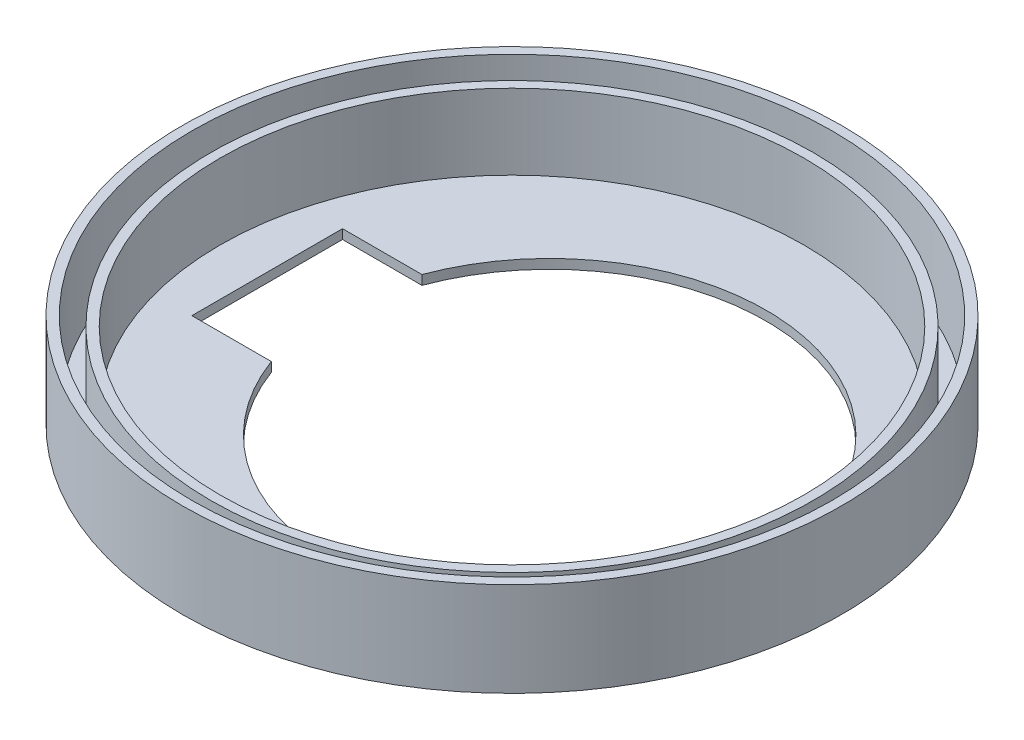
ISO-10303-21;
HEADER;
FILE_DESCRIPTION(('STEP AP214'),'2;1');
FILE_NAME('part.step','',(''),(''),'','','');
FILE_SCHEMA(('AUTOMOTIVE_DESIGN { 1 0 10303 214 1 1 1 1 }'));
ENDSEC;
DATA;
#1=APPLICATION_CONTEXT('core data for automotive mechanical design processes');
#2=APPLICATION_PROTOCOL_DEFINITION('international standard','automotive_design',2000,#1);
#3=PRODUCT_CONTEXT('',#1,'mechanical');
#4=PRODUCT('Part','Part','',(#3));
#5=PRODUCT_RELATED_PRODUCT_CATEGORY('part','',(#4));
#6=PRODUCT_DEFINITION_FORMATION('','',#4);
#7=PRODUCT_DEFINITION_CONTEXT('part definition',#1,'design');
#8=PRODUCT_DEFINITION('design','',#6,#7);
#9=PRODUCT_DEFINITION_SHAPE('','',#8);
#10=(LENGTH_UNIT() NAMED_UNIT(*) SI_UNIT(.MILLI.,.METRE.));
#11=(NAMED_UNIT(*) PLANE_ANGLE_UNIT() SI_UNIT($,.RADIAN.));
#12=(NAMED_UNIT(*) SI_UNIT($,.STERADIAN.) SOLID_ANGLE_UNIT());
#13=UNCERTAINTY_MEASURE_WITH_UNIT(LENGTH_MEASURE(1.E-05),#10,'distance_accuracy_value','');
#14=(GEOMETRIC_REPRESENTATION_CONTEXT(3) GLOBAL_UNCERTAINTY_ASSIGNED_CONTEXT((#13)) GLOBAL_UNIT_ASSIGNED_CONTEXT((#10,
#11,#12)) REPRESENTATION_CONTEXT('',''));
#15=CARTESIAN_POINT('',(0.,0.,0.));
#16=DIRECTION('',(0.,0.,1.));
#17=DIRECTION('',(1.,0.,0.));
#18=AXIS2_PLACEMENT_3D('',#15,#16,#17);
#19=CARTESIAN_POINT('',(0.,0.5,0.));
#20=DIRECTION('',(0.,1.,0.));
#21=DIRECTION('',(0.,0.,1.));
#22=AXIS2_PLACEMENT_3D('',#19,#20,#21);
#23=PLANE('',#22);
#24=CARTESIAN_POINT('',(0.,0.5,0.));
#25=DIRECTION('',(0.,1.,0.));
#26=DIRECTION('',(0.,0.,1.));
#27=AXIS2_PLACEMENT_3D('',#24,#25,#26);
#28=CIRCLE('',#27,16.);
#29=CARTESIAN_POINT('',(0.,0.5,16.));
#30=VERTEX_POINT('',#29);
#31=EDGE_CURVE('E95',#30,#30,#28,.F.);
#32=ORIENTED_EDGE('',*,*,#31,.T.);
#33=EDGE_LOOP('',(#32));
#34=FACE_BOUND('',#33,.T.);
#35=CARTESIAN_POINT('',(0.,0.5,0.));
#36=DIRECTION('',(0.,1.,0.));
#37=DIRECTION('',(0.,0.,1.));
#38=AXIS2_PLACEMENT_3D('',#35,#36,#37);
#39=CIRCLE('',#38,17.);
#40=CARTESIAN_POINT('',(0.,0.5,17.));
#41=VERTEX_POINT('',#40);
#42=EDGE_CURVE('E11',#41,#41,#39,.F.);
#43=ORIENTED_EDGE('',*,*,#42,.F.);
#44=EDGE_LOOP('',(#43));
#45=FACE_BOUND('',#44,.T.);
#46=ADVANCED_FACE('F33',(#34,#45),#23,.T.);
#47=DIRECTION('',(0.,0.,-1.));
#48=VECTOR('',#47,1.);
#49=CARTESIAN_POINT('',(-13.,0.5,0.));
#50=LINE('',#49,#48);
#51=CARTESIAN_POINT('',(-13.,0.5,4.));
#52=VERTEX_POINT('',#51);
#53=CARTESIAN_POINT('',(-13.,0.5,-4.));
#54=VERTEX_POINT('',#53);
#55=EDGE_CURVE('E106',#52,#54,#50,.T.);
#56=ORIENTED_EDGE('',*,*,#55,.T.);
#57=DIRECTION('',(1.,0.,0.));
#58=VECTOR('',#57,1.);
#59=CARTESIAN_POINT('',(0.,0.5,-4.));
#60=LINE('',#59,#58);
#61=CARTESIAN_POINT('',(-8.78192932642392,0.5,-4.));
#62=VERTEX_POINT('',#61);
#63=EDGE_CURVE('E78',#54,#62,#60,.T.);
#64=ORIENTED_EDGE('',*,*,#63,.T.);
#65=CARTESIAN_POINT('',(2.,0.5,0.));
#66=DIRECTION('',(0.,1.,0.));
#67=DIRECTION('',(0.,0.,1.));
#68=AXIS2_PLACEMENT_3D('',#65,#66,#67);
#69=CIRCLE('',#68,11.5);
#70=CARTESIAN_POINT('',(-8.78192932642392,0.5,4.));
#71=VERTEX_POINT('',#70);
#72=EDGE_CURVE('E108',#71,#62,#69,.T.);
#73=ORIENTED_EDGE('',*,*,#72,.F.);
#74=DIRECTION('',(-1.,0.,0.));
#75=VECTOR('',#74,1.);
#76=CARTESIAN_POINT('',(0.,0.5,4.));
#77=LINE('',#76,#75);
#78=EDGE_CURVE('E48',#71,#52,#77,.T.);
#79=ORIENTED_EDGE('',*,*,#78,.T.);
#80=EDGE_LOOP('',(#56,#64,#73,#79));
#81=FACE_BOUND('',#80,.T.);
#82=CARTESIAN_POINT('',(0.,0.5,0.));
#83=DIRECTION('',(0.,1.,0.));
#84=DIRECTION('',(0.,0.,1.));
#85=AXIS2_PLACEMENT_3D('',#82,#83,#84);
#86=CIRCLE('',#85,15.5);
#87=CARTESIAN_POINT('',(0.,0.5,15.5));
#88=VERTEX_POINT('',#87);
#89=EDGE_CURVE('E41',#88,#88,#86,.F.);
#90=ORIENTED_EDGE('',*,*,#89,.F.);
#91=EDGE_LOOP('',(#90));
#92=FACE_BOUND('',#91,.T.);
#93=ADVANCED_FACE('F148',(#81,#92),#23,.T.);
#94=CARTESIAN_POINT('',(0.,0.,0.));
#95=DIRECTION('',(0.,1.,0.));
#96=DIRECTION('',(0.,0.,1.));
#97=AXIS2_PLACEMENT_3D('',#94,#95,#96);
#98=PLANE('',#97);
#99=CARTESIAN_POINT('',(0.,0.,0.));
#100=DIRECTION('',(0.,1.,0.));
#101=DIRECTION('',(0.,0.,1.));
#102=AXIS2_PLACEMENT_3D('',#99,#100,#101);
#103=CIRCLE('',#102,17.5);
#104=CARTESIAN_POINT('',(0.,0.,17.5));
#105=VERTEX_POINT('',#104);
#106=EDGE_CURVE('E110',#105,#105,#103,.T.);
#107=ORIENTED_EDGE('',*,*,#106,.F.);
#108=EDGE_LOOP('',(#107));
#109=FACE_BOUND('',#108,.T.);
#110=DIRECTION('',(-1.,0.,0.));
#111=VECTOR('',#110,1.);
#112=CARTESIAN_POINT('',(2.,0.,-4.));
#113=LINE('',#112,#111);
#114=CARTESIAN_POINT('',(-8.78192932642392,0.,-4.));
#115=VERTEX_POINT('',#114);
#116=CARTESIAN_POINT('',(-13.,0.,-4.));
#117=VERTEX_POINT('',#116);
#118=EDGE_CURVE('E77',#115,#117,#113,.T.);
#119=ORIENTED_EDGE('',*,*,#118,.T.);
#120=DIRECTION('',(0.,0.,1.));
#121=VECTOR('',#120,1.);
#122=CARTESIAN_POINT('',(-13.,0.,-4.));
#123=LINE('',#122,#121);
#124=CARTESIAN_POINT('',(-13.,0.,4.));
#125=VERTEX_POINT('',#124);
#126=EDGE_CURVE('E84',#117,#125,#123,.T.);
#127=ORIENTED_EDGE('',*,*,#126,.T.);
#128=DIRECTION('',(1.,0.,0.));
#129=VECTOR('',#128,1.);
#130=CARTESIAN_POINT('',(2.,0.,4.));
#131=LINE('',#130,#129);
#132=CARTESIAN_POINT('',(-8.78192932642391,0.,4.));
#133=VERTEX_POINT('',#132);
#134=EDGE_CURVE('E89',#125,#133,#131,.T.);
#135=ORIENTED_EDGE('',*,*,#134,.T.);
#136=CARTESIAN_POINT('',(2.,0.,0.));
#137=DIRECTION('',(0.,1.,0.));
#138=DIRECTION('',(0.,0.,1.));
#139=AXIS2_PLACEMENT_3D('',#136,#137,#138);
#140=CIRCLE('',#139,11.5);
#141=EDGE_CURVE('E94',#133,#115,#140,.T.);
#142=ORIENTED_EDGE('',*,*,#141,.T.);
#143=EDGE_LOOP('',(#119,#127,#135,#142));
#144=FACE_BOUND('',#143,.T.);
#145=ADVANCED_FACE('F92',(#109,#144),#98,.F.);
#146=CARTESIAN_POINT('',(2.,0.,0.));
#147=DIRECTION('',(0.,1.,0.));
#148=DIRECTION('',(0.,0.,1.));
#149=AXIS2_PLACEMENT_3D('',#146,#147,#148);
#150=CYLINDRICAL_SURFACE('',#149,11.5);
#151=DIRECTION('',(0.,1.,0.));
#152=VECTOR('',#151,1.);
#153=CARTESIAN_POINT('',(-8.78192932642392,0.,-4.));
#154=LINE('',#153,#152);
#155=EDGE_CURVE('E56',#115,#62,#154,.T.);
#156=ORIENTED_EDGE('',*,*,#155,.F.);
#157=ORIENTED_EDGE('',*,*,#141,.F.);
#158=DIRECTION('',(0.,1.,0.));
#159=VECTOR('',#158,1.);
#160=CARTESIAN_POINT('',(-8.78192932642392,0.,4.));
#161=LINE('',#160,#159);
#162=EDGE_CURVE('E115',#71,#133,#161,.F.);
#163=ORIENTED_EDGE('',*,*,#162,.F.);
#164=ORIENTED_EDGE('',*,*,#72,.T.);
#165=EDGE_LOOP('',(#156,#157,#163,#164));
#166=FACE_BOUND('',#165,.T.);
#167=ADVANCED_FACE('F157',(#166),#150,.F.);
#168=CARTESIAN_POINT('',(0.,0.5,0.));
#169=DIRECTION('',(0.,-1.,0.));
#170=DIRECTION('',(0.,0.,-1.));
#171=AXIS2_PLACEMENT_3D('',#168,#169,#170);
#172=CYLINDRICAL_SURFACE('',#171,17.5);
#173=ORIENTED_EDGE('',*,*,#106,.T.);
#174=EDGE_LOOP('',(#173));
#175=FACE_BOUND('',#174,.T.);
#176=CARTESIAN_POINT('',(0.,5.,0.));
#177=DIRECTION('',(0.,1.,0.));
#178=DIRECTION('',(0.,0.,1.));
#179=AXIS2_PLACEMENT_3D('',#176,#177,#178);
#180=CIRCLE('',#179,17.5);
#181=CARTESIAN_POINT('',(0.,5.,17.5));
#182=VERTEX_POINT('',#181);
#183=EDGE_CURVE('E125',#182,#182,#180,.T.);
#184=ORIENTED_EDGE('',*,*,#183,.F.);
#185=EDGE_LOOP('',(#184));
#186=FACE_BOUND('',#185,.T.);
#187=ADVANCED_FACE('F35',(#175,#186),#172,.T.);
#188=CARTESIAN_POINT('',(2.,2.5,-4.));
#189=DIRECTION('',(0.,0.,1.));
#190=DIRECTION('',(1.,0.,0.));
#191=AXIS2_PLACEMENT_3D('',#188,#189,#190);
#192=PLANE('',#191);
#193=DIRECTION('',(0.,-1.,0.));
#194=VECTOR('',#193,1.);
#195=CARTESIAN_POINT('',(-13.,2.5,-4.));
#196=LINE('',#195,#194);
#197=EDGE_CURVE('E73',#54,#117,#196,.T.);
#198=ORIENTED_EDGE('',*,*,#197,.T.);
#199=ORIENTED_EDGE('',*,*,#118,.F.);
#200=ORIENTED_EDGE('',*,*,#155,.T.);
#201=ORIENTED_EDGE('',*,*,#63,.F.);
#202=EDGE_LOOP('',(#198,#199,#200,#201));
#203=FACE_BOUND('',#202,.T.);
#204=ADVANCED_FACE('F75',(#203),#192,.T.);
#205=CARTESIAN_POINT('',(-13.,2.5,-4.));
#206=DIRECTION('',(1.,0.,0.));
#207=DIRECTION('',(0.,0.,-1.));
#208=AXIS2_PLACEMENT_3D('',#205,#206,#207);
#209=PLANE('',#208);
#210=DIRECTION('',(0.,-1.,0.));
#211=VECTOR('',#210,1.);
#212=CARTESIAN_POINT('',(-13.,2.5,4.));
#213=LINE('',#212,#211);
#214=EDGE_CURVE('E81',#52,#125,#213,.T.);
#215=ORIENTED_EDGE('',*,*,#214,.T.);
#216=ORIENTED_EDGE('',*,*,#126,.F.);
#217=ORIENTED_EDGE('',*,*,#197,.F.);
#218=ORIENTED_EDGE('',*,*,#55,.F.);
#219=EDGE_LOOP('',(#215,#216,#217,#218));
#220=FACE_BOUND('',#219,.T.);
#221=ADVANCED_FACE('F85',(#220),#209,.T.);
#222=CARTESIAN_POINT('',(2.,2.5,4.));
#223=DIRECTION('',(0.,0.,-1.));
#224=DIRECTION('',(-1.,0.,0.));
#225=AXIS2_PLACEMENT_3D('',#222,#223,#224);
#226=PLANE('',#225);
#227=ORIENTED_EDGE('',*,*,#162,.T.);
#228=ORIENTED_EDGE('',*,*,#134,.F.);
#229=ORIENTED_EDGE('',*,*,#214,.F.);
#230=ORIENTED_EDGE('',*,*,#78,.F.);
#231=EDGE_LOOP('',(#227,#228,#229,#230));
#232=FACE_BOUND('',#231,.T.);
#233=ADVANCED_FACE('F176',(#232),#226,.T.);
#234=CARTESIAN_POINT('',(0.,4.5,0.));
#235=DIRECTION('',(0.,1.,0.));
#236=DIRECTION('',(0.,0.,1.));
#237=AXIS2_PLACEMENT_3D('',#234,#235,#236);
#238=PLANE('',#237);
#239=CARTESIAN_POINT('',(0.,4.5,0.));
#240=DIRECTION('',(0.,1.,0.));
#241=DIRECTION('',(0.,0.,1.));
#242=AXIS2_PLACEMENT_3D('',#239,#240,#241);
#243=CIRCLE('',#242,16.);
#244=CARTESIAN_POINT('',(0.,4.5,16.));
#245=VERTEX_POINT('',#244);
#246=EDGE_CURVE('E98',#245,#245,#243,.T.);
#247=ORIENTED_EDGE('',*,*,#246,.T.);
#248=EDGE_LOOP('',(#247));
#249=FACE_BOUND('',#248,.T.);
#250=CARTESIAN_POINT('',(0.,4.5,0.));
#251=DIRECTION('',(0.,1.,0.));
#252=DIRECTION('',(0.,0.,1.));
#253=AXIS2_PLACEMENT_3D('',#250,#251,#252);
#254=CIRCLE('',#253,15.5);
#255=CARTESIAN_POINT('',(0.,4.5,15.5));
#256=VERTEX_POINT('',#255);
#257=EDGE_CURVE('E122',#256,#256,#254,.T.);
#258=ORIENTED_EDGE('',*,*,#257,.F.);
#259=EDGE_LOOP('',(#258));
#260=FACE_BOUND('',#259,.T.);
#261=ADVANCED_FACE('F181',(#249,#260),#238,.T.);
#262=CARTESIAN_POINT('',(0.,4.5,0.));
#263=DIRECTION('',(0.,-1.,0.));
#264=DIRECTION('',(0.,0.,-1.));
#265=AXIS2_PLACEMENT_3D('',#262,#263,#264);
#266=CYLINDRICAL_SURFACE('',#265,16.);
#267=ORIENTED_EDGE('',*,*,#31,.F.);
#268=EDGE_LOOP('',(#267));
#269=FACE_BOUND('',#268,.T.);
#270=ORIENTED_EDGE('',*,*,#246,.F.);
#271=EDGE_LOOP('',(#270));
#272=FACE_BOUND('',#271,.T.);
#273=ADVANCED_FACE('F145',(#269,#272),#266,.T.);
#274=CARTESIAN_POINT('',(0.,4.5,0.));
#275=DIRECTION('',(0.,-1.,0.));
#276=DIRECTION('',(0.,0.,-1.));
#277=AXIS2_PLACEMENT_3D('',#274,#275,#276);
#278=CYLINDRICAL_SURFACE('',#277,15.5);
#279=ORIENTED_EDGE('',*,*,#89,.T.);
#280=EDGE_LOOP('',(#279));
#281=FACE_BOUND('',#280,.T.);
#282=ORIENTED_EDGE('',*,*,#257,.T.);
#283=EDGE_LOOP('',(#282));
#284=FACE_BOUND('',#283,.T.);
#285=ADVANCED_FACE('F137',(#281,#284),#278,.F.);
#286=CARTESIAN_POINT('',(0.,5.,0.));
#287=DIRECTION('',(0.,1.,0.));
#288=DIRECTION('',(0.,0.,1.));
#289=AXIS2_PLACEMENT_3D('',#286,#287,#288);
#290=PLANE('',#289);
#291=ORIENTED_EDGE('',*,*,#183,.T.);
#292=EDGE_LOOP('',(#291));
#293=FACE_BOUND('',#292,.T.);
#294=CARTESIAN_POINT('',(0.,5.,0.));
#295=DIRECTION('',(0.,1.,0.));
#296=DIRECTION('',(0.,0.,1.));
#297=AXIS2_PLACEMENT_3D('',#294,#295,#296);
#298=CIRCLE('',#297,17.);
#299=CARTESIAN_POINT('',(0.,5.,17.));
#300=VERTEX_POINT('',#299);
#301=EDGE_CURVE('E128',#300,#300,#298,.T.);
#302=ORIENTED_EDGE('',*,*,#301,.F.);
#303=EDGE_LOOP('',(#302));
#304=FACE_BOUND('',#303,.T.);
#305=ADVANCED_FACE('F135',(#293,#304),#290,.T.);
#306=CARTESIAN_POINT('',(0.,5.,0.));
#307=DIRECTION('',(0.,-1.,0.));
#308=DIRECTION('',(0.,0.,-1.));
#309=AXIS2_PLACEMENT_3D('',#306,#307,#308);
#310=CYLINDRICAL_SURFACE('',#309,17.);
#311=ORIENTED_EDGE('',*,*,#301,.T.);
#312=EDGE_LOOP('',(#311));
#313=FACE_BOUND('',#312,.T.);
#314=ORIENTED_EDGE('',*,*,#42,.T.);
#315=EDGE_LOOP('',(#314));
#316=FACE_BOUND('',#315,.T.);
#317=ADVANCED_FACE('F132',(#313,#316),#310,.F.);
#318=CLOSED_SHELL('',(#46,#93,#145,#167,#187,#204,#221,#233,#261,#273,#285,#305,#317));
#319=MANIFOLD_SOLID_BREP('B2',#318);
#320=ADVANCED_BREP_SHAPE_REPRESENTATION('',(#18,#319),#14);
#321=SHAPE_DEFINITION_REPRESENTATION(#9,#320);
ENDSEC;
END-ISO-10303-21;
